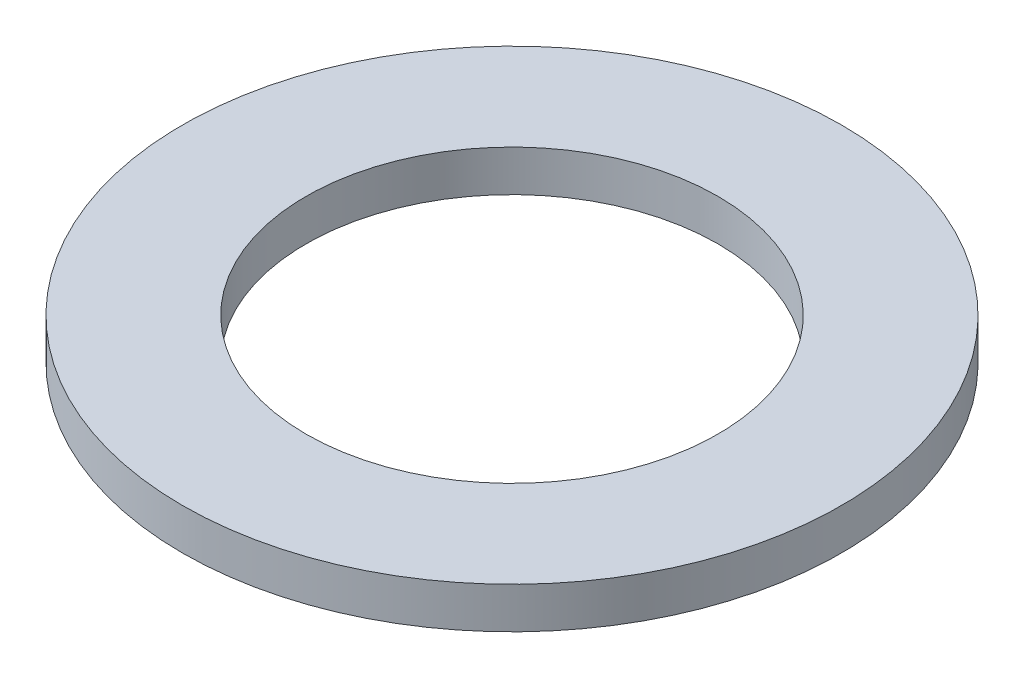
ISO-10303-21;
HEADER;
FILE_DESCRIPTION(('STEP AP214'),'2;1');
FILE_NAME('part.step','',(''),(''),'','','');
FILE_SCHEMA(('AUTOMOTIVE_DESIGN { 1 0 10303 214 1 1 1 1 }'));
ENDSEC;
DATA;
#1=APPLICATION_CONTEXT('core data for automotive mechanical design processes');
#2=APPLICATION_PROTOCOL_DEFINITION('international standard','automotive_design',2000,#1);
#3=PRODUCT_CONTEXT('',#1,'mechanical');
#4=PRODUCT('Part','Part','',(#3));
#5=PRODUCT_RELATED_PRODUCT_CATEGORY('part','',(#4));
#6=PRODUCT_DEFINITION_FORMATION('','',#4);
#7=PRODUCT_DEFINITION_CONTEXT('part definition',#1,'design');
#8=PRODUCT_DEFINITION('design','',#6,#7);
#9=PRODUCT_DEFINITION_SHAPE('','',#8);
#10=(LENGTH_UNIT() NAMED_UNIT(*) SI_UNIT(.MILLI.,.METRE.));
#11=(NAMED_UNIT(*) PLANE_ANGLE_UNIT() SI_UNIT($,.RADIAN.));
#12=(NAMED_UNIT(*) SI_UNIT($,.STERADIAN.) SOLID_ANGLE_UNIT());
#13=UNCERTAINTY_MEASURE_WITH_UNIT(LENGTH_MEASURE(1.E-05),#10,'distance_accuracy_value','');
#14=(GEOMETRIC_REPRESENTATION_CONTEXT(3) GLOBAL_UNCERTAINTY_ASSIGNED_CONTEXT((#13)) GLOBAL_UNIT_ASSIGNED_CONTEXT((#10,
#11,#12)) REPRESENTATION_CONTEXT('',''));
#15=CARTESIAN_POINT('',(0.,0.,0.));
#16=DIRECTION('',(0.,0.,1.));
#17=DIRECTION('',(1.,0.,0.));
#18=AXIS2_PLACEMENT_3D('',#15,#16,#17);
#19=CARTESIAN_POINT('',(0.,0.5,0.));
#20=DIRECTION('',(0.,1.,0.));
#21=DIRECTION('',(0.,0.,1.));
#22=AXIS2_PLACEMENT_3D('',#19,#20,#21);
#23=PLANE('',#22);
#24=CARTESIAN_POINT('',(0.,0.5,0.));
#25=DIRECTION('',(0.,1.,0.));
#26=DIRECTION('',(0.,0.,1.));
#27=AXIS2_PLACEMENT_3D('',#24,#25,#26);
#28=CIRCLE('',#27,4.);
#29=CARTESIAN_POINT('',(0.,0.5,4.));
#30=VERTEX_POINT('',#29);
#31=EDGE_CURVE('E10',#30,#30,#28,.T.);
#32=ORIENTED_EDGE('',*,*,#31,.T.);
#33=EDGE_LOOP('',(#32));
#34=FACE_BOUND('',#33,.T.);
#35=CARTESIAN_POINT('',(0.,0.5,0.));
#36=DIRECTION('',(0.,1.,0.));
#37=DIRECTION('',(0.,0.,1.));
#38=AXIS2_PLACEMENT_3D('',#35,#36,#37);
#39=CIRCLE('',#38,2.5);
#40=CARTESIAN_POINT('',(0.,0.5,2.5));
#41=VERTEX_POINT('',#40);
#42=EDGE_CURVE('E41',#41,#41,#39,.T.);
#43=ORIENTED_EDGE('',*,*,#42,.F.);
#44=EDGE_LOOP('',(#43));
#45=FACE_BOUND('',#44,.T.);
#46=ADVANCED_FACE('F30',(#34,#45),#23,.T.);
#47=CARTESIAN_POINT('',(0.,0.,0.));
#48=DIRECTION('',(0.,1.,0.));
#49=DIRECTION('',(0.,0.,1.));
#50=AXIS2_PLACEMENT_3D('',#47,#48,#49);
#51=PLANE('',#50);
#52=CARTESIAN_POINT('',(0.,0.,0.));
#53=DIRECTION('',(0.,1.,0.));
#54=DIRECTION('',(0.,0.,1.));
#55=AXIS2_PLACEMENT_3D('',#52,#53,#54);
#56=CIRCLE('',#55,4.);
#57=CARTESIAN_POINT('',(0.,0.,4.));
#58=VERTEX_POINT('',#57);
#59=EDGE_CURVE('E34',#58,#58,#56,.T.);
#60=ORIENTED_EDGE('',*,*,#59,.F.);
#61=EDGE_LOOP('',(#60));
#62=FACE_BOUND('',#61,.T.);
#63=CARTESIAN_POINT('',(0.,0.,0.));
#64=DIRECTION('',(0.,1.,0.));
#65=DIRECTION('',(0.,0.,1.));
#66=AXIS2_PLACEMENT_3D('',#63,#64,#65);
#67=CIRCLE('',#66,2.5);
#68=CARTESIAN_POINT('',(0.,0.,2.5));
#69=VERTEX_POINT('',#68);
#70=EDGE_CURVE('E43',#69,#69,#67,.T.);
#71=ORIENTED_EDGE('',*,*,#70,.T.);
#72=EDGE_LOOP('',(#71));
#73=FACE_BOUND('',#72,.T.);
#74=ADVANCED_FACE('F53',(#62,#73),#51,.F.);
#75=CARTESIAN_POINT('',(0.,0.5,0.));
#76=DIRECTION('',(0.,-1.,0.));
#77=DIRECTION('',(0.,0.,-1.));
#78=AXIS2_PLACEMENT_3D('',#75,#76,#77);
#79=CYLINDRICAL_SURFACE('',#78,4.);
#80=ORIENTED_EDGE('',*,*,#31,.F.);
#81=EDGE_LOOP('',(#80));
#82=FACE_BOUND('',#81,.T.);
#83=ORIENTED_EDGE('',*,*,#59,.T.);
#84=EDGE_LOOP('',(#83));
#85=FACE_BOUND('',#84,.T.);
#86=ADVANCED_FACE('F32',(#82,#85),#79,.T.);
#87=CARTESIAN_POINT('',(0.,0.5,0.));
#88=DIRECTION('',(0.,-1.,0.));
#89=DIRECTION('',(0.,0.,-1.));
#90=AXIS2_PLACEMENT_3D('',#87,#88,#89);
#91=CYLINDRICAL_SURFACE('',#90,2.5);
#92=ORIENTED_EDGE('',*,*,#42,.T.);
#93=EDGE_LOOP('',(#92));
#94=FACE_BOUND('',#93,.T.);
#95=ORIENTED_EDGE('',*,*,#70,.F.);
#96=EDGE_LOOP('',(#95));
#97=FACE_BOUND('',#96,.T.);
#98=ADVANCED_FACE('F49',(#94,#97),#91,.F.);
#99=CLOSED_SHELL('',(#46,#74,#86,#98));
#100=MANIFOLD_SOLID_BREP('B2',#99);
#101=ADVANCED_BREP_SHAPE_REPRESENTATION('',(#18,#100),#14);
#102=SHAPE_DEFINITION_REPRESENTATION(#9,#101);
ENDSEC;
END-ISO-10303-21;
